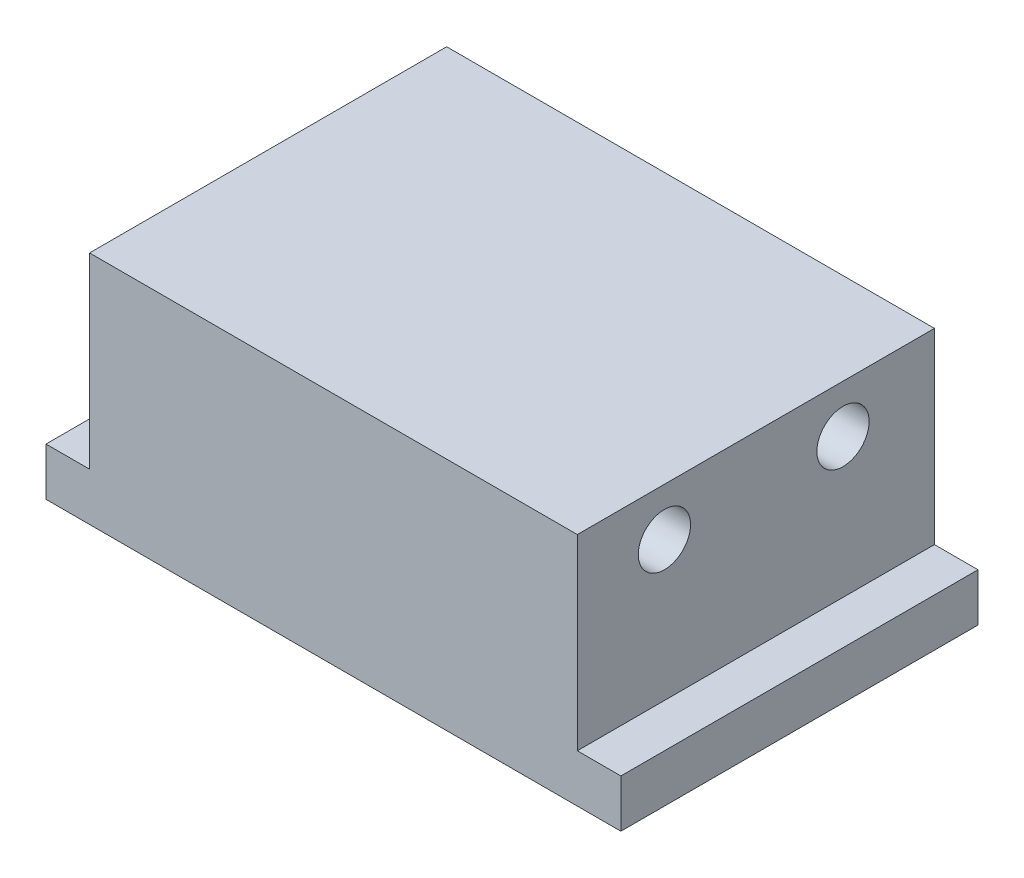
ISO-10303-21;
HEADER;
FILE_DESCRIPTION(('STEP AP214'),'2;1');
FILE_NAME('part.step','',(''),(''),'','','');
FILE_SCHEMA(('AUTOMOTIVE_DESIGN { 1 0 10303 214 1 1 1 1 }'));
ENDSEC;
DATA;
#1=APPLICATION_CONTEXT('core data for automotive mechanical design processes');
#2=APPLICATION_PROTOCOL_DEFINITION('international standard','automotive_design',2000,#1);
#3=PRODUCT_CONTEXT('',#1,'mechanical');
#4=PRODUCT('Part','Part','',(#3));
#5=PRODUCT_RELATED_PRODUCT_CATEGORY('part','',(#4));
#6=PRODUCT_DEFINITION_FORMATION('','',#4);
#7=PRODUCT_DEFINITION_CONTEXT('part definition',#1,'design');
#8=PRODUCT_DEFINITION('design','',#6,#7);
#9=PRODUCT_DEFINITION_SHAPE('','',#8);
#10=(LENGTH_UNIT() NAMED_UNIT(*) SI_UNIT(.MILLI.,.METRE.));
#11=(NAMED_UNIT(*) PLANE_ANGLE_UNIT() SI_UNIT($,.RADIAN.));
#12=(NAMED_UNIT(*) SI_UNIT($,.STERADIAN.) SOLID_ANGLE_UNIT());
#13=UNCERTAINTY_MEASURE_WITH_UNIT(LENGTH_MEASURE(1.E-05),#10,'distance_accuracy_value','');
#14=(GEOMETRIC_REPRESENTATION_CONTEXT(3) GLOBAL_UNCERTAINTY_ASSIGNED_CONTEXT((#13)) GLOBAL_UNIT_ASSIGNED_CONTEXT((#10,
#11,#12)) REPRESENTATION_CONTEXT('',''));
#15=CARTESIAN_POINT('',(0.,0.,0.));
#16=DIRECTION('',(0.,0.,1.));
#17=DIRECTION('',(1.,0.,0.));
#18=AXIS2_PLACEMENT_3D('',#15,#16,#17);
#19=CARTESIAN_POINT('',(-43.9850220264317,23.939052152889,-6.85064316205311));
#20=DIRECTION('',(0.,1.,0.));
#21=DIRECTION('',(0.,0.,1.));
#22=AXIS2_PLACEMENT_3D('',#19,#20,#21);
#23=PLANE('',#22);
#24=DIRECTION('',(0.,0.,1.));
#25=VECTOR('',#24,1.);
#26=CARTESIAN_POINT('',(-54.4722466960353,23.939052152889,-11.7092334704232));
#27=LINE('',#26,#25);
#28=CARTESIAN_POINT('',(-54.4722466960353,23.939052152889,-11.7092334704232));
#29=VERTEX_POINT('',#28);
#30=CARTESIAN_POINT('',(-54.4722466960353,23.939052152889,-3.50923347042315));
#31=VERTEX_POINT('',#30);
#32=EDGE_CURVE('E50',#29,#31,#27,.T.);
#33=ORIENTED_EDGE('',*,*,#32,.F.);
#34=DIRECTION('',(-1.,0.,0.));
#35=VECTOR('',#34,1.);
#36=CARTESIAN_POINT('',(-55.4722466960353,23.939052152889,-11.7092334704232));
#37=LINE('',#36,#35);
#38=CARTESIAN_POINT('',(-55.4722466960353,23.939052152889,-11.7092334704232));
#39=VERTEX_POINT('',#38);
#40=EDGE_CURVE('E139',#29,#39,#37,.T.);
#41=ORIENTED_EDGE('',*,*,#40,.T.);
#42=DIRECTION('',(0.,0.,1.));
#43=VECTOR('',#42,1.);
#44=CARTESIAN_POINT('',(-55.4722466960353,23.939052152889,-11.7092334704232));
#45=LINE('',#44,#43);
#46=CARTESIAN_POINT('',(-55.4722466960353,23.939052152889,-3.50923347042315));
#47=VERTEX_POINT('',#46);
#48=EDGE_CURVE('E130',#39,#47,#45,.T.);
#49=ORIENTED_EDGE('',*,*,#48,.T.);
#50=DIRECTION('',(1.,0.,0.));
#51=VECTOR('',#50,1.);
#52=CARTESIAN_POINT('',(-55.4722466960353,23.939052152889,-3.50923347042315));
#53=LINE('',#52,#51);
#54=EDGE_CURVE('E135',#47,#31,#53,.T.);
#55=ORIENTED_EDGE('',*,*,#54,.T.);
#56=EDGE_LOOP('',(#33,#41,#49,#55));
#57=FACE_BOUND('',#56,.T.);
#58=ADVANCED_FACE('F35',(#57),#23,.T.);
#59=CARTESIAN_POINT('',(-55.4722466960353,23.939052152889,-11.7092334704232));
#60=DIRECTION('',(1.,0.,0.));
#61=DIRECTION('',(0.,0.,-1.));
#62=AXIS2_PLACEMENT_3D('',#59,#60,#61);
#63=PLANE('',#62);
#64=DIRECTION('',(0.,0.,1.));
#65=VECTOR('',#64,1.);
#66=CARTESIAN_POINT('',(-55.4722466960353,22.839052152889,-11.7092334704232));
#67=LINE('',#66,#65);
#68=CARTESIAN_POINT('',(-55.4722466960353,22.839052152889,-11.7092334704232));
#69=VERTEX_POINT('',#68);
#70=CARTESIAN_POINT('',(-55.4722466960353,22.839052152889,-3.50923347042315));
#71=VERTEX_POINT('',#70);
#72=EDGE_CURVE('E121',#69,#71,#67,.T.);
#73=ORIENTED_EDGE('',*,*,#72,.T.);
#74=DIRECTION('',(0.,-1.,0.));
#75=VECTOR('',#74,1.);
#76=CARTESIAN_POINT('',(-55.4722466960353,23.939052152889,-3.50923347042315));
#77=LINE('',#76,#75);
#78=EDGE_CURVE('E11',#47,#71,#77,.T.);
#79=ORIENTED_EDGE('',*,*,#78,.F.);
#80=ORIENTED_EDGE('',*,*,#48,.F.);
#81=DIRECTION('',(0.,-1.,0.));
#82=VECTOR('',#81,1.);
#83=CARTESIAN_POINT('',(-55.4722466960353,23.939052152889,-11.7092334704232));
#84=LINE('',#83,#82);
#85=EDGE_CURVE('E141',#39,#69,#84,.T.);
#86=ORIENTED_EDGE('',*,*,#85,.T.);
#87=EDGE_LOOP('',(#73,#79,#80,#86));
#88=FACE_BOUND('',#87,.T.);
#89=ADVANCED_FACE('F37',(#88),#63,.F.);
#90=CARTESIAN_POINT('',(-55.4722466960353,23.939052152889,-3.50923347042315));
#91=DIRECTION('',(0.,0.,-1.));
#92=DIRECTION('',(-1.,0.,0.));
#93=AXIS2_PLACEMENT_3D('',#90,#91,#92);
#94=PLANE('',#93);
#95=DIRECTION('',(1.,0.,0.));
#96=VECTOR('',#95,1.);
#97=CARTESIAN_POINT('',(-55.4722466960353,22.839052152889,-3.50923347042315));
#98=LINE('',#97,#96);
#99=CARTESIAN_POINT('',(-42.2722466960353,22.839052152889,-3.50923347042315));
#100=VERTEX_POINT('',#99);
#101=EDGE_CURVE('E124',#71,#100,#98,.T.);
#102=ORIENTED_EDGE('',*,*,#101,.T.);
#103=DIRECTION('',(0.,-1.,0.));
#104=VECTOR('',#103,1.);
#105=CARTESIAN_POINT('',(-42.2722466960353,23.939052152889,-3.50923347042315));
#106=LINE('',#105,#104);
#107=CARTESIAN_POINT('',(-42.2722466960353,23.939052152889,-3.50923347042315));
#108=VERTEX_POINT('',#107);
#109=EDGE_CURVE('E43',#108,#100,#106,.T.);
#110=ORIENTED_EDGE('',*,*,#109,.F.);
#111=CARTESIAN_POINT('',(-43.2722466960353,23.939052152889,-3.50923347042315));
#112=VERTEX_POINT('',#111);
#113=EDGE_CURVE('E133',#112,#108,#53,.T.);
#114=ORIENTED_EDGE('',*,*,#113,.F.);
#115=DIRECTION('',(0.,-1.,0.));
#116=VECTOR('',#115,1.);
#117=CARTESIAN_POINT('',(-43.2722466960353,28.239052152889,-3.50923347042315));
#118=LINE('',#117,#116);
#119=CARTESIAN_POINT('',(-43.2722466960353,28.239052152889,-3.50923347042315));
#120=VERTEX_POINT('',#119);
#121=EDGE_CURVE('E106',#120,#112,#118,.T.);
#122=ORIENTED_EDGE('',*,*,#121,.F.);
#123=DIRECTION('',(1.,0.,0.));
#124=VECTOR('',#123,1.);
#125=CARTESIAN_POINT('',(-54.4722466960353,28.239052152889,-3.50923347042315));
#126=LINE('',#125,#124);
#127=CARTESIAN_POINT('',(-54.4722466960353,28.239052152889,-3.50923347042315));
#128=VERTEX_POINT('',#127);
#129=EDGE_CURVE('E100',#128,#120,#126,.T.);
#130=ORIENTED_EDGE('',*,*,#129,.F.);
#131=DIRECTION('',(0.,-1.,0.));
#132=VECTOR('',#131,1.);
#133=CARTESIAN_POINT('',(-54.4722466960353,28.239052152889,-3.50923347042315));
#134=LINE('',#133,#132);
#135=EDGE_CURVE('E104',#128,#31,#134,.T.);
#136=ORIENTED_EDGE('',*,*,#135,.T.);
#137=ORIENTED_EDGE('',*,*,#54,.F.);
#138=ORIENTED_EDGE('',*,*,#78,.T.);
#139=EDGE_LOOP('',(#102,#110,#114,#122,#130,#136,#137,#138));
#140=FACE_BOUND('',#139,.T.);
#141=ADVANCED_FACE('F102',(#140),#94,.F.);
#142=CARTESIAN_POINT('',(-42.2722466960353,23.939052152889,-11.7092334704232));
#143=DIRECTION('',(-1.,0.,0.));
#144=DIRECTION('',(0.,0.,1.));
#145=AXIS2_PLACEMENT_3D('',#142,#143,#144);
#146=PLANE('',#145);
#147=DIRECTION('',(0.,0.,-1.));
#148=VECTOR('',#147,1.);
#149=CARTESIAN_POINT('',(-42.2722466960353,22.839052152889,-11.7092334704232));
#150=LINE('',#149,#148);
#151=CARTESIAN_POINT('',(-42.2722466960353,22.839052152889,-11.7092334704232));
#152=VERTEX_POINT('',#151);
#153=EDGE_CURVE('E144',#100,#152,#150,.T.);
#154=ORIENTED_EDGE('',*,*,#153,.T.);
#155=DIRECTION('',(0.,-1.,0.));
#156=VECTOR('',#155,1.);
#157=CARTESIAN_POINT('',(-42.2722466960353,23.939052152889,-11.7092334704232));
#158=LINE('',#157,#156);
#159=CARTESIAN_POINT('',(-42.2722466960353,23.939052152889,-11.7092334704232));
#160=VERTEX_POINT('',#159);
#161=EDGE_CURVE('E149',#160,#152,#158,.T.);
#162=ORIENTED_EDGE('',*,*,#161,.F.);
#163=DIRECTION('',(0.,0.,-1.));
#164=VECTOR('',#163,1.);
#165=CARTESIAN_POINT('',(-42.2722466960353,23.939052152889,-11.7092334704232));
#166=LINE('',#165,#164);
#167=EDGE_CURVE('E137',#108,#160,#166,.T.);
#168=ORIENTED_EDGE('',*,*,#167,.F.);
#169=ORIENTED_EDGE('',*,*,#109,.T.);
#170=EDGE_LOOP('',(#154,#162,#168,#169));
#171=FACE_BOUND('',#170,.T.);
#172=ADVANCED_FACE('F156',(#171),#146,.F.);
#173=CARTESIAN_POINT('',(-55.4722466960353,23.939052152889,-11.7092334704232));
#174=DIRECTION('',(0.,0.,1.));
#175=DIRECTION('',(1.,0.,0.));
#176=AXIS2_PLACEMENT_3D('',#173,#174,#175);
#177=PLANE('',#176);
#178=DIRECTION('',(-1.,0.,0.));
#179=VECTOR('',#178,1.);
#180=CARTESIAN_POINT('',(-55.4722466960353,22.839052152889,-11.7092334704232));
#181=LINE('',#180,#179);
#182=EDGE_CURVE('E134',#152,#69,#181,.T.);
#183=ORIENTED_EDGE('',*,*,#182,.T.);
#184=ORIENTED_EDGE('',*,*,#85,.F.);
#185=ORIENTED_EDGE('',*,*,#40,.F.);
#186=DIRECTION('',(0.,-1.,0.));
#187=VECTOR('',#186,1.);
#188=CARTESIAN_POINT('',(-54.4722466960353,28.239052152889,-11.7092334704232));
#189=LINE('',#188,#187);
#190=CARTESIAN_POINT('',(-54.4722466960353,28.239052152889,-11.7092334704232));
#191=VERTEX_POINT('',#190);
#192=EDGE_CURVE('E169',#191,#29,#189,.T.);
#193=ORIENTED_EDGE('',*,*,#192,.F.);
#194=DIRECTION('',(-1.,0.,0.));
#195=VECTOR('',#194,1.);
#196=CARTESIAN_POINT('',(-54.4722466960353,28.239052152889,-11.7092334704232));
#197=LINE('',#196,#195);
#198=CARTESIAN_POINT('',(-43.2722466960353,28.239052152889,-11.7092334704232));
#199=VERTEX_POINT('',#198);
#200=EDGE_CURVE('E115',#199,#191,#197,.T.);
#201=ORIENTED_EDGE('',*,*,#200,.F.);
#202=DIRECTION('',(0.,-1.,0.));
#203=VECTOR('',#202,1.);
#204=CARTESIAN_POINT('',(-43.2722466960353,28.239052152889,-11.7092334704232));
#205=LINE('',#204,#203);
#206=CARTESIAN_POINT('',(-43.2722466960353,23.939052152889,-11.7092334704232));
#207=VERTEX_POINT('',#206);
#208=EDGE_CURVE('E126',#199,#207,#205,.T.);
#209=ORIENTED_EDGE('',*,*,#208,.T.);
#210=EDGE_CURVE('E140',#160,#207,#37,.T.);
#211=ORIENTED_EDGE('',*,*,#210,.F.);
#212=ORIENTED_EDGE('',*,*,#161,.T.);
#213=EDGE_LOOP('',(#183,#184,#185,#193,#201,#209,#211,#212));
#214=FACE_BOUND('',#213,.T.);
#215=ADVANCED_FACE('F164',(#214),#177,.F.);
#216=DIRECTION('',(0.,0.,-1.));
#217=VECTOR('',#216,1.);
#218=CARTESIAN_POINT('',(-43.2722466960353,23.939052152889,-11.7092334704232));
#219=LINE('',#218,#217);
#220=EDGE_CURVE('E58',#112,#207,#219,.T.);
#221=ORIENTED_EDGE('',*,*,#220,.F.);
#222=ORIENTED_EDGE('',*,*,#113,.T.);
#223=ORIENTED_EDGE('',*,*,#167,.T.);
#224=ORIENTED_EDGE('',*,*,#210,.T.);
#225=EDGE_LOOP('',(#221,#222,#223,#224));
#226=FACE_BOUND('',#225,.T.);
#227=ADVANCED_FACE('F199',(#226),#23,.T.);
#228=CARTESIAN_POINT('',(-43.9850220264317,22.839052152889,-6.85064316205311));
#229=DIRECTION('',(0.,1.,0.));
#230=DIRECTION('',(0.,0.,1.));
#231=AXIS2_PLACEMENT_3D('',#228,#229,#230);
#232=PLANE('',#231);
#233=ORIENTED_EDGE('',*,*,#72,.F.);
#234=ORIENTED_EDGE('',*,*,#182,.F.);
#235=ORIENTED_EDGE('',*,*,#153,.F.);
#236=ORIENTED_EDGE('',*,*,#101,.F.);
#237=EDGE_LOOP('',(#233,#234,#235,#236));
#238=FACE_BOUND('',#237,.T.);
#239=ADVANCED_FACE('F161',(#238),#232,.F.);
#240=CARTESIAN_POINT('',(-54.4722466960353,28.239052152889,-11.7092334704232));
#241=DIRECTION('',(1.,0.,0.));
#242=DIRECTION('',(0.,0.,-1.));
#243=AXIS2_PLACEMENT_3D('',#240,#241,#242);
#244=PLANE('',#243);
#245=CARTESIAN_POINT('',(-54.4722466960353,27.139052152889,-5.50923347042315));
#246=DIRECTION('',(1.,0.,0.));
#247=DIRECTION('',(0.,0.,-1.));
#248=AXIS2_PLACEMENT_3D('',#245,#246,#247);
#249=CIRCLE('',#248,0.6);
#250=CARTESIAN_POINT('',(-54.4722466960353,27.139052152889,-6.10923347042315));
#251=VERTEX_POINT('',#250);
#252=EDGE_CURVE('E175',#251,#251,#249,.F.);
#253=ORIENTED_EDGE('',*,*,#252,.F.);
#254=EDGE_LOOP('',(#253));
#255=FACE_BOUND('',#254,.T.);
#256=CARTESIAN_POINT('',(-54.4722466960353,27.139052152889,-9.60923347042315));
#257=DIRECTION('',(1.,0.,0.));
#258=DIRECTION('',(0.,0.,-1.));
#259=AXIS2_PLACEMENT_3D('',#256,#257,#258);
#260=CIRCLE('',#259,0.599999999999999);
#261=CARTESIAN_POINT('',(-54.4722466960353,27.139052152889,-10.2092334704231));
#262=VERTEX_POINT('',#261);
#263=EDGE_CURVE('E178',#262,#262,#260,.F.);
#264=ORIENTED_EDGE('',*,*,#263,.F.);
#265=EDGE_LOOP('',(#264));
#266=FACE_BOUND('',#265,.T.);
#267=ORIENTED_EDGE('',*,*,#32,.T.);
#268=ORIENTED_EDGE('',*,*,#135,.F.);
#269=DIRECTION('',(0.,0.,1.));
#270=VECTOR('',#269,1.);
#271=CARTESIAN_POINT('',(-54.4722466960353,28.239052152889,-11.7092334704232));
#272=LINE('',#271,#270);
#273=EDGE_CURVE('E110',#191,#128,#272,.T.);
#274=ORIENTED_EDGE('',*,*,#273,.F.);
#275=ORIENTED_EDGE('',*,*,#192,.T.);
#276=EDGE_LOOP('',(#267,#268,#274,#275));
#277=FACE_BOUND('',#276,.T.);
#278=ADVANCED_FACE('F120',(#255,#266,#277),#244,.F.);
#279=CARTESIAN_POINT('',(-43.2722466960353,28.239052152889,-11.7092334704232));
#280=DIRECTION('',(-1.,0.,0.));
#281=DIRECTION('',(0.,0.,1.));
#282=AXIS2_PLACEMENT_3D('',#279,#280,#281);
#283=PLANE('',#282);
#284=CARTESIAN_POINT('',(-43.2722466960353,27.139052152889,-5.50923347042315));
#285=DIRECTION('',(1.,0.,0.));
#286=DIRECTION('',(0.,0.,-1.));
#287=AXIS2_PLACEMENT_3D('',#284,#285,#286);
#288=CIRCLE('',#287,0.6);
#289=CARTESIAN_POINT('',(-43.2722466960353,27.139052152889,-6.10923347042315));
#290=VERTEX_POINT('',#289);
#291=EDGE_CURVE('E181',#290,#290,#288,.T.);
#292=ORIENTED_EDGE('',*,*,#291,.F.);
#293=EDGE_LOOP('',(#292));
#294=FACE_BOUND('',#293,.T.);
#295=CARTESIAN_POINT('',(-43.2722466960353,27.139052152889,-9.60923347042315));
#296=DIRECTION('',(1.,0.,0.));
#297=DIRECTION('',(0.,0.,-1.));
#298=AXIS2_PLACEMENT_3D('',#295,#296,#297);
#299=CIRCLE('',#298,0.599999999999999);
#300=CARTESIAN_POINT('',(-43.2722466960353,27.139052152889,-10.2092334704232));
#301=VERTEX_POINT('',#300);
#302=EDGE_CURVE('E182',#301,#301,#299,.T.);
#303=ORIENTED_EDGE('',*,*,#302,.F.);
#304=EDGE_LOOP('',(#303));
#305=FACE_BOUND('',#304,.T.);
#306=ORIENTED_EDGE('',*,*,#220,.T.);
#307=ORIENTED_EDGE('',*,*,#208,.F.);
#308=DIRECTION('',(0.,0.,-1.));
#309=VECTOR('',#308,1.);
#310=CARTESIAN_POINT('',(-43.2722466960353,28.239052152889,-11.7092334704232));
#311=LINE('',#310,#309);
#312=EDGE_CURVE('E109',#120,#199,#311,.T.);
#313=ORIENTED_EDGE('',*,*,#312,.F.);
#314=ORIENTED_EDGE('',*,*,#121,.T.);
#315=EDGE_LOOP('',(#306,#307,#313,#314));
#316=FACE_BOUND('',#315,.T.);
#317=ADVANCED_FACE('F192',(#294,#305,#316),#283,.F.);
#318=CARTESIAN_POINT('',(-43.9850220264317,28.239052152889,-6.85064316205311));
#319=DIRECTION('',(0.,1.,0.));
#320=DIRECTION('',(0.,0.,1.));
#321=AXIS2_PLACEMENT_3D('',#318,#319,#320);
#322=PLANE('',#321);
#323=ORIENTED_EDGE('',*,*,#273,.T.);
#324=ORIENTED_EDGE('',*,*,#129,.T.);
#325=ORIENTED_EDGE('',*,*,#312,.T.);
#326=ORIENTED_EDGE('',*,*,#200,.T.);
#327=EDGE_LOOP('',(#323,#324,#325,#326));
#328=FACE_BOUND('',#327,.T.);
#329=ADVANCED_FACE('F113',(#328),#322,.T.);
#330=CARTESIAN_POINT('',(-56.169302970883,27.139052152889,-9.60923347042315));
#331=DIRECTION('',(1.,0.,0.));
#332=DIRECTION('',(0.,0.,-1.));
#333=AXIS2_PLACEMENT_3D('',#330,#331,#332);
#334=CYLINDRICAL_SURFACE('',#333,0.599999999999999);
#335=ORIENTED_EDGE('',*,*,#263,.T.);
#336=EDGE_LOOP('',(#335));
#337=FACE_BOUND('',#336,.T.);
#338=ORIENTED_EDGE('',*,*,#302,.T.);
#339=EDGE_LOOP('',(#338));
#340=FACE_BOUND('',#339,.T.);
#341=ADVANCED_FACE('F262',(#337,#340),#334,.F.);
#342=CARTESIAN_POINT('',(-56.169302970883,27.139052152889,-5.50923347042315));
#343=DIRECTION('',(1.,0.,0.));
#344=DIRECTION('',(0.,0.,-1.));
#345=AXIS2_PLACEMENT_3D('',#342,#343,#344);
#346=CYLINDRICAL_SURFACE('',#345,0.6);
#347=ORIENTED_EDGE('',*,*,#252,.T.);
#348=EDGE_LOOP('',(#347));
#349=FACE_BOUND('',#348,.T.);
#350=ORIENTED_EDGE('',*,*,#291,.T.);
#351=EDGE_LOOP('',(#350));
#352=FACE_BOUND('',#351,.T.);
#353=ADVANCED_FACE('F190',(#349,#352),#346,.F.);
#354=CLOSED_SHELL('',(#58,#89,#141,#172,#215,#227,#239,#278,#317,#329,#341,#353));
#355=MANIFOLD_SOLID_BREP('B2',#354);
#356=ADVANCED_BREP_SHAPE_REPRESENTATION('',(#18,#355),#14);
#357=SHAPE_DEFINITION_REPRESENTATION(#9,#356);
ENDSEC;
END-ISO-10303-21;
